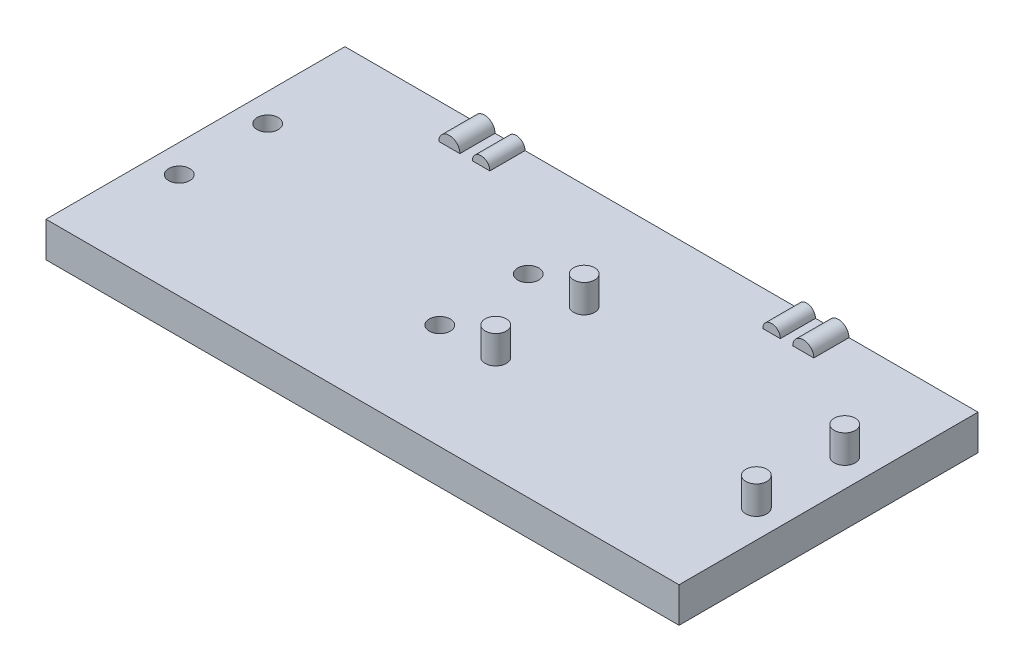
ISO-10303-21;
HEADER;
FILE_DESCRIPTION(('STEP AP214'),'2;1');
FILE_NAME('part.step','',(''),(''),'','','');
FILE_SCHEMA(('AUTOMOTIVE_DESIGN { 1 0 10303 214 1 1 1 1 }'));
ENDSEC;
DATA;
#1=APPLICATION_CONTEXT('core data for automotive mechanical design processes');
#2=APPLICATION_PROTOCOL_DEFINITION('international standard','automotive_design',2000,#1);
#3=PRODUCT_CONTEXT('',#1,'mechanical');
#4=PRODUCT('Part','Part','',(#3));
#5=PRODUCT_RELATED_PRODUCT_CATEGORY('part','',(#4));
#6=PRODUCT_DEFINITION_FORMATION('','',#4);
#7=PRODUCT_DEFINITION_CONTEXT('part definition',#1,'design');
#8=PRODUCT_DEFINITION('design','',#6,#7);
#9=PRODUCT_DEFINITION_SHAPE('','',#8);
#10=(LENGTH_UNIT() NAMED_UNIT(*) SI_UNIT(.MILLI.,.METRE.));
#11=(NAMED_UNIT(*) PLANE_ANGLE_UNIT() SI_UNIT($,.RADIAN.));
#12=(NAMED_UNIT(*) SI_UNIT($,.STERADIAN.) SOLID_ANGLE_UNIT());
#13=UNCERTAINTY_MEASURE_WITH_UNIT(LENGTH_MEASURE(1.E-05),#10,'distance_accuracy_value','');
#14=(GEOMETRIC_REPRESENTATION_CONTEXT(3) GLOBAL_UNCERTAINTY_ASSIGNED_CONTEXT((#13)) GLOBAL_UNIT_ASSIGNED_CONTEXT((#10,
#11,#12)) REPRESENTATION_CONTEXT('',''));
#15=CARTESIAN_POINT('',(0.,0.,0.));
#16=DIRECTION('',(0.,0.,1.));
#17=DIRECTION('',(1.,0.,0.));
#18=AXIS2_PLACEMENT_3D('',#15,#16,#17);
#19=CARTESIAN_POINT('',(-90.,10.,-42.5));
#20=DIRECTION('',(1.,0.,0.));
#21=DIRECTION('',(0.,0.,-1.));
#22=AXIS2_PLACEMENT_3D('',#19,#20,#21);
#23=PLANE('',#22);
#24=DIRECTION('',(0.,0.,1.));
#25=VECTOR('',#24,1.);
#26=CARTESIAN_POINT('',(-90.,0.,-42.5));
#27=LINE('',#26,#25);
#28=CARTESIAN_POINT('',(-90.,0.,-42.5));
#29=VERTEX_POINT('',#28);
#30=CARTESIAN_POINT('',(-89.9999999999999,0.,42.5));
#31=VERTEX_POINT('',#30);
#32=EDGE_CURVE('E231',#29,#31,#27,.T.);
#33=ORIENTED_EDGE('',*,*,#32,.T.);
#34=DIRECTION('',(0.,-1.,0.));
#35=VECTOR('',#34,1.);
#36=CARTESIAN_POINT('',(-89.9999999999999,10.,42.5));
#37=LINE('',#36,#35);
#38=CARTESIAN_POINT('',(-89.9999999999999,10.,42.5));
#39=VERTEX_POINT('',#38);
#40=EDGE_CURVE('E255',#39,#31,#37,.T.);
#41=ORIENTED_EDGE('',*,*,#40,.F.);
#42=DIRECTION('',(0.,0.,1.));
#43=VECTOR('',#42,1.);
#44=CARTESIAN_POINT('',(-90.,10.,-42.5));
#45=LINE('',#44,#43);
#46=CARTESIAN_POINT('',(-90.,10.,-42.5));
#47=VERTEX_POINT('',#46);
#48=EDGE_CURVE('E234',#47,#39,#45,.T.);
#49=ORIENTED_EDGE('',*,*,#48,.F.);
#50=DIRECTION('',(0.,-1.,0.));
#51=VECTOR('',#50,1.);
#52=CARTESIAN_POINT('',(-90.,10.,-42.5));
#53=LINE('',#52,#51);
#54=EDGE_CURVE('E128',#47,#29,#53,.T.);
#55=ORIENTED_EDGE('',*,*,#54,.T.);
#56=EDGE_LOOP('',(#33,#41,#49,#55));
#57=FACE_BOUND('',#56,.T.);
#58=ADVANCED_FACE('F35',(#57),#23,.F.);
#59=CARTESIAN_POINT('',(-89.9999999999999,10.,42.5));
#60=DIRECTION('',(0.,0.,-1.));
#61=DIRECTION('',(-1.,0.,0.));
#62=AXIS2_PLACEMENT_3D('',#59,#60,#61);
#63=PLANE('',#62);
#64=DIRECTION('',(1.,0.,0.));
#65=VECTOR('',#64,1.);
#66=CARTESIAN_POINT('',(-89.9999999999999,0.,42.5));
#67=LINE('',#66,#65);
#68=CARTESIAN_POINT('',(90.0000000000001,0.,42.5));
#69=VERTEX_POINT('',#68);
#70=EDGE_CURVE('E243',#31,#69,#67,.T.);
#71=ORIENTED_EDGE('',*,*,#70,.T.);
#72=DIRECTION('',(0.,-1.,0.));
#73=VECTOR('',#72,1.);
#74=CARTESIAN_POINT('',(90.0000000000001,10.,42.5));
#75=LINE('',#74,#73);
#76=CARTESIAN_POINT('',(90.0000000000001,10.,42.5));
#77=VERTEX_POINT('',#76);
#78=EDGE_CURVE('E252',#77,#69,#75,.T.);
#79=ORIENTED_EDGE('',*,*,#78,.F.);
#80=DIRECTION('',(1.,0.,0.));
#81=VECTOR('',#80,1.);
#82=CARTESIAN_POINT('',(-89.9999999999999,10.,42.5));
#83=LINE('',#82,#81);
#84=EDGE_CURVE('E236',#39,#77,#83,.T.);
#85=ORIENTED_EDGE('',*,*,#84,.F.);
#86=ORIENTED_EDGE('',*,*,#40,.T.);
#87=EDGE_LOOP('',(#71,#79,#85,#86));
#88=FACE_BOUND('',#87,.T.);
#89=ADVANCED_FACE('F283',(#88),#63,.F.);
#90=CARTESIAN_POINT('',(90.,10.,-42.5));
#91=DIRECTION('',(-1.,0.,0.));
#92=DIRECTION('',(0.,0.,1.));
#93=AXIS2_PLACEMENT_3D('',#90,#91,#92);
#94=PLANE('',#93);
#95=DIRECTION('',(0.,0.,-1.));
#96=VECTOR('',#95,1.);
#97=CARTESIAN_POINT('',(90.,0.,-42.5));
#98=LINE('',#97,#96);
#99=CARTESIAN_POINT('',(90.,0.,-42.5));
#100=VERTEX_POINT('',#99);
#101=EDGE_CURVE('E245',#69,#100,#98,.T.);
#102=ORIENTED_EDGE('',*,*,#101,.T.);
#103=DIRECTION('',(0.,-1.,0.));
#104=VECTOR('',#103,1.);
#105=CARTESIAN_POINT('',(90.,10.,-42.5));
#106=LINE('',#105,#104);
#107=CARTESIAN_POINT('',(90.,10.,-42.5));
#108=VERTEX_POINT('',#107);
#109=EDGE_CURVE('E249',#108,#100,#106,.T.);
#110=ORIENTED_EDGE('',*,*,#109,.F.);
#111=DIRECTION('',(0.,0.,-1.));
#112=VECTOR('',#111,1.);
#113=CARTESIAN_POINT('',(90.,10.,-42.5));
#114=LINE('',#113,#112);
#115=EDGE_CURVE('E132',#77,#108,#114,.T.);
#116=ORIENTED_EDGE('',*,*,#115,.F.);
#117=ORIENTED_EDGE('',*,*,#78,.T.);
#118=EDGE_LOOP('',(#102,#110,#116,#117));
#119=FACE_BOUND('',#118,.T.);
#120=ADVANCED_FACE('F288',(#119),#94,.F.);
#121=CARTESIAN_POINT('',(-90.,10.,-42.5));
#122=DIRECTION('',(0.,0.,1.));
#123=DIRECTION('',(1.,0.,0.));
#124=AXIS2_PLACEMENT_3D('',#121,#122,#123);
#125=PLANE('',#124);
#126=DIRECTION('',(-1.,0.,0.));
#127=VECTOR('',#126,1.);
#128=CARTESIAN_POINT('',(-90.,0.,-42.5));
#129=LINE('',#128,#127);
#130=EDGE_CURVE('E237',#100,#29,#129,.T.);
#131=ORIENTED_EDGE('',*,*,#130,.T.);
#132=ORIENTED_EDGE('',*,*,#54,.F.);
#133=DIRECTION('',(-1.,0.,0.));
#134=VECTOR('',#133,1.);
#135=CARTESIAN_POINT('',(-90.,10.,-42.5));
#136=LINE('',#135,#134);
#137=CARTESIAN_POINT('',(-53.3192352652046,10.,-42.5));
#138=VERTEX_POINT('',#137);
#139=EDGE_CURVE('E123',#138,#47,#136,.T.);
#140=ORIENTED_EDGE('',*,*,#139,.F.);
#141=CARTESIAN_POINT('',(-50.3192352652046,10.,-42.5));
#142=DIRECTION('',(0.,0.,-1.));
#143=DIRECTION('',(-1.,0.,0.));
#144=AXIS2_PLACEMENT_3D('',#141,#142,#143);
#145=CIRCLE('',#144,3.);
#146=CARTESIAN_POINT('',(-47.3192352652046,10.,-42.5));
#147=VERTEX_POINT('',#146);
#148=EDGE_CURVE('E126',#138,#147,#145,.T.);
#149=ORIENTED_EDGE('',*,*,#148,.T.);
#150=CARTESIAN_POINT('',(-43.7947027926347,10.,-42.5));
#151=VERTEX_POINT('',#150);
#152=EDGE_CURVE('E131',#151,#147,#136,.T.);
#153=ORIENTED_EDGE('',*,*,#152,.F.);
#154=CARTESIAN_POINT('',(-41.2947027926347,10.,-42.5));
#155=DIRECTION('',(0.,0.,-1.));
#156=DIRECTION('',(-1.,0.,0.));
#157=AXIS2_PLACEMENT_3D('',#154,#155,#156);
#158=CIRCLE('',#157,2.5);
#159=CARTESIAN_POINT('',(-38.7947027926347,10.,-42.5));
#160=VERTEX_POINT('',#159);
#161=EDGE_CURVE('E161',#151,#160,#158,.T.);
#162=ORIENTED_EDGE('',*,*,#161,.T.);
#163=CARTESIAN_POINT('',(38.7947027926347,10.,-42.5));
#164=VERTEX_POINT('',#163);
#165=EDGE_CURVE('E134',#164,#160,#136,.T.);
#166=ORIENTED_EDGE('',*,*,#165,.F.);
#167=CARTESIAN_POINT('',(41.2947027926347,10.,-42.5));
#168=DIRECTION('',(0.,0.,-1.));
#169=DIRECTION('',(1.,0.,0.));
#170=AXIS2_PLACEMENT_3D('',#167,#168,#169);
#171=CIRCLE('',#170,2.5);
#172=CARTESIAN_POINT('',(43.7947027926346,10.,-42.5));
#173=VERTEX_POINT('',#172);
#174=EDGE_CURVE('E141',#164,#173,#171,.T.);
#175=ORIENTED_EDGE('',*,*,#174,.T.);
#176=CARTESIAN_POINT('',(47.3192352652046,10.,-42.5));
#177=VERTEX_POINT('',#176);
#178=EDGE_CURVE('E240',#177,#173,#136,.T.);
#179=ORIENTED_EDGE('',*,*,#178,.F.);
#180=CARTESIAN_POINT('',(50.3192352652046,10.,-42.5));
#181=DIRECTION('',(0.,0.,-1.));
#182=DIRECTION('',(1.,0.,0.));
#183=AXIS2_PLACEMENT_3D('',#180,#181,#182);
#184=CIRCLE('',#183,3.);
#185=CARTESIAN_POINT('',(53.3192352652045,10.,-42.5));
#186=VERTEX_POINT('',#185);
#187=EDGE_CURVE('E175',#177,#186,#184,.T.);
#188=ORIENTED_EDGE('',*,*,#187,.T.);
#189=EDGE_CURVE('E135',#108,#186,#136,.T.);
#190=ORIENTED_EDGE('',*,*,#189,.F.);
#191=ORIENTED_EDGE('',*,*,#109,.T.);
#192=EDGE_LOOP('',(#131,#132,#140,#149,#153,#162,#166,#175,#179,#188,#190,#191));
#193=FACE_BOUND('',#192,.T.);
#194=ADVANCED_FACE('F124',(#193),#125,.F.);
#195=CARTESIAN_POINT('',(0.,10.,0.));
#196=DIRECTION('',(0.,1.,0.));
#197=DIRECTION('',(0.,0.,1.));
#198=AXIS2_PLACEMENT_3D('',#195,#196,#197);
#199=PLANE('',#198);
#200=DIRECTION('',(0.,0.,-1.));
#201=VECTOR('',#200,1.);
#202=CARTESIAN_POINT('',(-47.3192352652046,10.,-32.5));
#203=LINE('',#202,#201);
#204=CARTESIAN_POINT('',(-47.3192352652046,10.,-32.5));
#205=VERTEX_POINT('',#204);
#206=EDGE_CURVE('E54',#205,#147,#203,.T.);
#207=ORIENTED_EDGE('',*,*,#206,.F.);
#208=DIRECTION('',(-1.,0.,0.));
#209=VECTOR('',#208,1.);
#210=CARTESIAN_POINT('',(-53.3192352652046,10.,-32.5));
#211=LINE('',#210,#209);
#212=CARTESIAN_POINT('',(-53.3192352652046,10.,-32.5));
#213=VERTEX_POINT('',#212);
#214=EDGE_CURVE('E49',#205,#213,#211,.T.);
#215=ORIENTED_EDGE('',*,*,#214,.T.);
#216=DIRECTION('',(0.,0.,-1.));
#217=VECTOR('',#216,1.);
#218=CARTESIAN_POINT('',(-53.3192352652046,10.,-32.5));
#219=LINE('',#218,#217);
#220=EDGE_CURVE('E136',#213,#138,#219,.T.);
#221=ORIENTED_EDGE('',*,*,#220,.T.);
#222=ORIENTED_EDGE('',*,*,#139,.T.);
#223=ORIENTED_EDGE('',*,*,#48,.T.);
#224=ORIENTED_EDGE('',*,*,#84,.T.);
#225=ORIENTED_EDGE('',*,*,#115,.T.);
#226=ORIENTED_EDGE('',*,*,#189,.T.);
#227=DIRECTION('',(0.,0.,-1.));
#228=VECTOR('',#227,1.);
#229=CARTESIAN_POINT('',(53.3192352652046,10.,-32.5));
#230=LINE('',#229,#228);
#231=CARTESIAN_POINT('',(53.3192352652046,10.,-32.5));
#232=VERTEX_POINT('',#231);
#233=EDGE_CURVE('E183',#232,#186,#230,.T.);
#234=ORIENTED_EDGE('',*,*,#233,.F.);
#235=DIRECTION('',(-1.,0.,0.));
#236=VECTOR('',#235,1.);
#237=CARTESIAN_POINT('',(53.3192352652046,10.,-32.5));
#238=LINE('',#237,#236);
#239=CARTESIAN_POINT('',(47.3192352652046,10.,-32.5));
#240=VERTEX_POINT('',#239);
#241=EDGE_CURVE('E181',#232,#240,#238,.T.);
#242=ORIENTED_EDGE('',*,*,#241,.T.);
#243=DIRECTION('',(0.,0.,-1.));
#244=VECTOR('',#243,1.);
#245=CARTESIAN_POINT('',(47.3192352652046,10.,-32.5));
#246=LINE('',#245,#244);
#247=EDGE_CURVE('E186',#240,#177,#246,.T.);
#248=ORIENTED_EDGE('',*,*,#247,.T.);
#249=ORIENTED_EDGE('',*,*,#178,.T.);
#250=DIRECTION('',(0.,0.,-1.));
#251=VECTOR('',#250,1.);
#252=CARTESIAN_POINT('',(43.7947027926347,10.,-32.5));
#253=LINE('',#252,#251);
#254=CARTESIAN_POINT('',(43.7947027926347,10.,-32.5));
#255=VERTEX_POINT('',#254);
#256=EDGE_CURVE('E155',#255,#173,#253,.T.);
#257=ORIENTED_EDGE('',*,*,#256,.F.);
#258=DIRECTION('',(-1.,0.,0.));
#259=VECTOR('',#258,1.);
#260=CARTESIAN_POINT('',(43.7947027926347,10.,-32.5));
#261=LINE('',#260,#259);
#262=CARTESIAN_POINT('',(38.7947027926347,10.,-32.5));
#263=VERTEX_POINT('',#262);
#264=EDGE_CURVE('E153',#255,#263,#261,.T.);
#265=ORIENTED_EDGE('',*,*,#264,.T.);
#266=DIRECTION('',(0.,0.,-1.));
#267=VECTOR('',#266,1.);
#268=CARTESIAN_POINT('',(38.7947027926347,10.,-32.5));
#269=LINE('',#268,#267);
#270=EDGE_CURVE('E158',#263,#164,#269,.T.);
#271=ORIENTED_EDGE('',*,*,#270,.T.);
#272=ORIENTED_EDGE('',*,*,#165,.T.);
#273=DIRECTION('',(0.,0.,-1.));
#274=VECTOR('',#273,1.);
#275=CARTESIAN_POINT('',(-38.7947027926347,10.,-32.5));
#276=LINE('',#275,#274);
#277=CARTESIAN_POINT('',(-38.7947027926347,10.,-32.5));
#278=VERTEX_POINT('',#277);
#279=EDGE_CURVE('E169',#278,#160,#276,.T.);
#280=ORIENTED_EDGE('',*,*,#279,.F.);
#281=DIRECTION('',(-1.,0.,0.));
#282=VECTOR('',#281,1.);
#283=CARTESIAN_POINT('',(-43.7947027926347,10.,-32.5));
#284=LINE('',#283,#282);
#285=CARTESIAN_POINT('',(-43.7947027926347,10.,-32.5));
#286=VERTEX_POINT('',#285);
#287=EDGE_CURVE('E167',#278,#286,#284,.T.);
#288=ORIENTED_EDGE('',*,*,#287,.T.);
#289=DIRECTION('',(0.,0.,-1.));
#290=VECTOR('',#289,1.);
#291=CARTESIAN_POINT('',(-43.7947027926347,10.,-32.5));
#292=LINE('',#291,#290);
#293=EDGE_CURVE('E172',#286,#151,#292,.T.);
#294=ORIENTED_EDGE('',*,*,#293,.T.);
#295=ORIENTED_EDGE('',*,*,#152,.T.);
#296=EDGE_LOOP('',(#207,#215,#221,#222,#223,#224,#225,#226,#234,#242,#248,#249,#257,#265,#271,
#272,#280,#288,#294,#295));
#297=FACE_BOUND('',#296,.T.);
#298=CARTESIAN_POINT('',(-7.95465094927429,10.,-12.5714647739015));
#299=DIRECTION('',(0.,-1.,0.));
#300=DIRECTION('',(0.,0.,-1.));
#301=AXIS2_PLACEMENT_3D('',#298,#299,#300);
#302=CIRCLE('',#301,3.00000000000001);
#303=CARTESIAN_POINT('',(-7.95465094927429,10.,-15.5714647739015));
#304=VERTEX_POINT('',#303);
#305=EDGE_CURVE('E192',#304,#304,#302,.T.);
#306=ORIENTED_EDGE('',*,*,#305,.T.);
#307=EDGE_LOOP('',(#306));
#308=FACE_BOUND('',#307,.T.);
#309=CARTESIAN_POINT('',(-7.95465094927429,10.,12.5714647739015));
#310=DIRECTION('',(0.,1.,0.));
#311=DIRECTION('',(0.,0.,1.));
#312=AXIS2_PLACEMENT_3D('',#309,#310,#311);
#313=CIRCLE('',#312,3.00000000000001);
#314=CARTESIAN_POINT('',(-7.95465094927429,10.,15.5714647739015));
#315=VERTEX_POINT('',#314);
#316=EDGE_CURVE('E198',#315,#315,#313,.T.);
#317=ORIENTED_EDGE('',*,*,#316,.F.);
#318=EDGE_LOOP('',(#317));
#319=FACE_BOUND('',#318,.T.);
#320=CARTESIAN_POINT('',(-82.0453490507256,10.,12.5714647739015));
#321=DIRECTION('',(0.,-1.,0.));
#322=DIRECTION('',(0.,0.,-1.));
#323=AXIS2_PLACEMENT_3D('',#320,#321,#322);
#324=CIRCLE('',#323,3.00000000000001);
#325=CARTESIAN_POINT('',(-82.0453490507256,10.,9.57146477390153));
#326=VERTEX_POINT('',#325);
#327=EDGE_CURVE('E204',#326,#326,#324,.T.);
#328=ORIENTED_EDGE('',*,*,#327,.T.);
#329=EDGE_LOOP('',(#328));
#330=FACE_BOUND('',#329,.T.);
#331=CARTESIAN_POINT('',(-82.0453490507256,10.,-12.5714647739015));
#332=DIRECTION('',(0.,1.,0.));
#333=DIRECTION('',(0.,0.,1.));
#334=AXIS2_PLACEMENT_3D('',#331,#332,#333);
#335=CIRCLE('',#334,3.00000000000001);
#336=CARTESIAN_POINT('',(-82.0453490507256,10.,-9.57146477390153));
#337=VERTEX_POINT('',#336);
#338=EDGE_CURVE('E207',#337,#337,#335,.T.);
#339=ORIENTED_EDGE('',*,*,#338,.F.);
#340=EDGE_LOOP('',(#339));
#341=FACE_BOUND('',#340,.T.);
#342=CARTESIAN_POINT('',(82.0453490507256,10.,-12.5714647739015));
#343=DIRECTION('',(0.,1.,0.));
#344=DIRECTION('',(0.,0.,1.));
#345=AXIS2_PLACEMENT_3D('',#342,#343,#344);
#346=CIRCLE('',#345,3.00000000000001);
#347=CARTESIAN_POINT('',(82.0453490507256,10.,-9.57146477390153));
#348=VERTEX_POINT('',#347);
#349=EDGE_CURVE('E11',#348,#348,#346,.T.);
#350=ORIENTED_EDGE('',*,*,#349,.F.);
#351=EDGE_LOOP('',(#350));
#352=FACE_BOUND('',#351,.T.);
#353=CARTESIAN_POINT('',(82.0453490507256,10.,12.5714647739015));
#354=DIRECTION('',(0.,1.,0.));
#355=DIRECTION('',(0.,0.,1.));
#356=AXIS2_PLACEMENT_3D('',#353,#354,#355);
#357=CIRCLE('',#356,3.00000000000001);
#358=CARTESIAN_POINT('',(82.0453490507256,10.,15.5714647739015));
#359=VERTEX_POINT('',#358);
#360=EDGE_CURVE('E219',#359,#359,#357,.T.);
#361=ORIENTED_EDGE('',*,*,#360,.F.);
#362=EDGE_LOOP('',(#361));
#363=FACE_BOUND('',#362,.T.);
#364=CARTESIAN_POINT('',(7.95465094927429,10.,12.5714647739015));
#365=DIRECTION('',(0.,1.,0.));
#366=DIRECTION('',(0.,0.,1.));
#367=AXIS2_PLACEMENT_3D('',#364,#365,#366);
#368=CIRCLE('',#367,3.00000000000001);
#369=CARTESIAN_POINT('',(7.95465094927429,10.,15.5714647739015));
#370=VERTEX_POINT('',#369);
#371=EDGE_CURVE('E42',#370,#370,#368,.T.);
#372=ORIENTED_EDGE('',*,*,#371,.F.);
#373=EDGE_LOOP('',(#372));
#374=FACE_BOUND('',#373,.T.);
#375=CARTESIAN_POINT('',(7.95465094927429,10.,-12.5714647739015));
#376=DIRECTION('',(0.,1.,0.));
#377=DIRECTION('',(0.,0.,1.));
#378=AXIS2_PLACEMENT_3D('',#375,#376,#377);
#379=CIRCLE('',#378,3.00000000000001);
#380=CARTESIAN_POINT('',(7.95465094927429,10.,-9.57146477390153));
#381=VERTEX_POINT('',#380);
#382=EDGE_CURVE('E227',#381,#381,#379,.T.);
#383=ORIENTED_EDGE('',*,*,#382,.F.);
#384=EDGE_LOOP('',(#383));
#385=FACE_BOUND('',#384,.T.);
#386=ADVANCED_FACE('F137',(#297,#308,#319,#330,#341,#352,#363,#374,#385),#199,.T.);
#387=CARTESIAN_POINT('',(0.,0.,0.));
#388=DIRECTION('',(0.,1.,0.));
#389=DIRECTION('',(0.,0.,1.));
#390=AXIS2_PLACEMENT_3D('',#387,#388,#389);
#391=PLANE('',#390);
#392=ORIENTED_EDGE('',*,*,#32,.F.);
#393=ORIENTED_EDGE('',*,*,#130,.F.);
#394=ORIENTED_EDGE('',*,*,#101,.F.);
#395=ORIENTED_EDGE('',*,*,#70,.F.);
#396=EDGE_LOOP('',(#392,#393,#394,#395));
#397=FACE_BOUND('',#396,.T.);
#398=ADVANCED_FACE('F264',(#397),#391,.F.);
#399=CARTESIAN_POINT('',(7.95465094927429,18.,-12.5714647739015));
#400=DIRECTION('',(0.,-1.,0.));
#401=DIRECTION('',(0.,0.,-1.));
#402=AXIS2_PLACEMENT_3D('',#399,#400,#401);
#403=CYLINDRICAL_SURFACE('',#402,3.00000000000001);
#404=CARTESIAN_POINT('',(7.95465094927429,18.,-12.5714647739015));
#405=DIRECTION('',(0.,1.,0.));
#406=DIRECTION('',(0.,0.,1.));
#407=AXIS2_PLACEMENT_3D('',#404,#405,#406);
#408=CIRCLE('',#407,3.00000000000001);
#409=CARTESIAN_POINT('',(7.95465094927429,18.,-9.57146477390153));
#410=VERTEX_POINT('',#409);
#411=EDGE_CURVE('E228',#410,#410,#408,.T.);
#412=ORIENTED_EDGE('',*,*,#411,.F.);
#413=EDGE_LOOP('',(#412));
#414=FACE_BOUND('',#413,.T.);
#415=ORIENTED_EDGE('',*,*,#382,.T.);
#416=EDGE_LOOP('',(#415));
#417=FACE_BOUND('',#416,.T.);
#418=ADVANCED_FACE('F268',(#414,#417),#403,.T.);
#419=CARTESIAN_POINT('',(7.95465094927429,18.,-12.5714647739015));
#420=DIRECTION('',(0.,1.,0.));
#421=DIRECTION('',(0.,0.,1.));
#422=AXIS2_PLACEMENT_3D('',#419,#420,#421);
#423=PLANE('',#422);
#424=ORIENTED_EDGE('',*,*,#411,.T.);
#425=EDGE_LOOP('',(#424));
#426=FACE_BOUND('',#425,.T.);
#427=ADVANCED_FACE('F270',(#426),#423,.T.);
#428=CARTESIAN_POINT('',(7.95465094927429,18.,12.5714647739015));
#429=DIRECTION('',(0.,-1.,0.));
#430=DIRECTION('',(0.,0.,-1.));
#431=AXIS2_PLACEMENT_3D('',#428,#429,#430);
#432=CYLINDRICAL_SURFACE('',#431,3.00000000000001);
#433=CARTESIAN_POINT('',(7.95465094927429,18.,12.5714647739015));
#434=DIRECTION('',(0.,-1.,0.));
#435=DIRECTION('',(0.,0.,-1.));
#436=AXIS2_PLACEMENT_3D('',#433,#434,#435);
#437=CIRCLE('',#436,3.00000000000001);
#438=CARTESIAN_POINT('',(7.95465094927429,18.,9.57146477390153));
#439=VERTEX_POINT('',#438);
#440=EDGE_CURVE('E222',#439,#439,#437,.T.);
#441=ORIENTED_EDGE('',*,*,#440,.T.);
#442=EDGE_LOOP('',(#441));
#443=FACE_BOUND('',#442,.T.);
#444=ORIENTED_EDGE('',*,*,#371,.T.);
#445=EDGE_LOOP('',(#444));
#446=FACE_BOUND('',#445,.T.);
#447=ADVANCED_FACE('F260',(#443,#446),#432,.T.);
#448=CARTESIAN_POINT('',(7.95465094927429,18.,12.5714647739015));
#449=DIRECTION('',(0.,-1.,0.));
#450=DIRECTION('',(0.,0.,-1.));
#451=AXIS2_PLACEMENT_3D('',#448,#449,#450);
#452=PLANE('',#451);
#453=ORIENTED_EDGE('',*,*,#440,.F.);
#454=EDGE_LOOP('',(#453));
#455=FACE_BOUND('',#454,.T.);
#456=ADVANCED_FACE('F364',(#455),#452,.F.);
#457=CARTESIAN_POINT('',(82.0453490507256,18.,12.5714647739015));
#458=DIRECTION('',(0.,-1.,0.));
#459=DIRECTION('',(0.,0.,-1.));
#460=AXIS2_PLACEMENT_3D('',#457,#458,#459);
#461=CYLINDRICAL_SURFACE('',#460,3.00000000000001);
#462=CARTESIAN_POINT('',(82.0453490507256,18.,12.5714647739015));
#463=DIRECTION('',(0.,1.,0.));
#464=DIRECTION('',(0.,0.,1.));
#465=AXIS2_PLACEMENT_3D('',#462,#463,#464);
#466=CIRCLE('',#465,3.00000000000001);
#467=CARTESIAN_POINT('',(82.0453490507256,18.,15.5714647739015));
#468=VERTEX_POINT('',#467);
#469=EDGE_CURVE('E218',#468,#468,#466,.T.);
#470=ORIENTED_EDGE('',*,*,#469,.F.);
#471=EDGE_LOOP('',(#470));
#472=FACE_BOUND('',#471,.T.);
#473=ORIENTED_EDGE('',*,*,#360,.T.);
#474=EDGE_LOOP('',(#473));
#475=FACE_BOUND('',#474,.T.);
#476=ADVANCED_FACE('F361',(#472,#475),#461,.T.);
#477=CARTESIAN_POINT('',(82.0453490507256,18.,12.5714647739015));
#478=DIRECTION('',(0.,1.,0.));
#479=DIRECTION('',(0.,0.,1.));
#480=AXIS2_PLACEMENT_3D('',#477,#478,#479);
#481=PLANE('',#480);
#482=ORIENTED_EDGE('',*,*,#469,.T.);
#483=EDGE_LOOP('',(#482));
#484=FACE_BOUND('',#483,.T.);
#485=ADVANCED_FACE('F356',(#484),#481,.T.);
#486=CARTESIAN_POINT('',(82.0453490507256,18.,-12.5714647739015));
#487=DIRECTION('',(0.,-1.,0.));
#488=DIRECTION('',(0.,0.,-1.));
#489=AXIS2_PLACEMENT_3D('',#486,#487,#488);
#490=CYLINDRICAL_SURFACE('',#489,3.00000000000001);
#491=CARTESIAN_POINT('',(82.0453490507256,18.,-12.5714647739015));
#492=DIRECTION('',(0.,-1.,0.));
#493=DIRECTION('',(0.,0.,-1.));
#494=AXIS2_PLACEMENT_3D('',#491,#492,#493);
#495=CIRCLE('',#494,3.00000000000001);
#496=CARTESIAN_POINT('',(82.0453490507256,18.,-15.5714647739015));
#497=VERTEX_POINT('',#496);
#498=EDGE_CURVE('E213',#497,#497,#495,.T.);
#499=ORIENTED_EDGE('',*,*,#498,.T.);
#500=EDGE_LOOP('',(#499));
#501=FACE_BOUND('',#500,.T.);
#502=ORIENTED_EDGE('',*,*,#349,.T.);
#503=EDGE_LOOP('',(#502));
#504=FACE_BOUND('',#503,.T.);
#505=ADVANCED_FACE('F353',(#501,#504),#490,.T.);
#506=CARTESIAN_POINT('',(82.0453490507256,18.,-12.5714647739015));
#507=DIRECTION('',(0.,-1.,0.));
#508=DIRECTION('',(0.,0.,-1.));
#509=AXIS2_PLACEMENT_3D('',#506,#507,#508);
#510=PLANE('',#509);
#511=ORIENTED_EDGE('',*,*,#498,.F.);
#512=EDGE_LOOP('',(#511));
#513=FACE_BOUND('',#512,.T.);
#514=ADVANCED_FACE('F351',(#513),#510,.F.);
#515=CARTESIAN_POINT('',(-82.0453490507256,2.,-12.5714647739015));
#516=DIRECTION('',(0.,1.,0.));
#517=DIRECTION('',(0.,0.,1.));
#518=AXIS2_PLACEMENT_3D('',#515,#516,#517);
#519=CYLINDRICAL_SURFACE('',#518,3.00000000000001);
#520=CARTESIAN_POINT('',(-82.0453490507256,2.,-12.5714647739015));
#521=DIRECTION('',(0.,1.,0.));
#522=DIRECTION('',(0.,0.,1.));
#523=AXIS2_PLACEMENT_3D('',#520,#521,#522);
#524=CIRCLE('',#523,3.00000000000001);
#525=CARTESIAN_POINT('',(-82.0453490507256,2.,-9.57146477390153));
#526=VERTEX_POINT('',#525);
#527=EDGE_CURVE('E210',#526,#526,#524,.T.);
#528=ORIENTED_EDGE('',*,*,#527,.F.);
#529=EDGE_LOOP('',(#528));
#530=FACE_BOUND('',#529,.T.);
#531=ORIENTED_EDGE('',*,*,#338,.T.);
#532=EDGE_LOOP('',(#531));
#533=FACE_BOUND('',#532,.T.);
#534=ADVANCED_FACE('F347',(#530,#533),#519,.F.);
#535=CARTESIAN_POINT('',(-82.0453490507256,2.,-12.5714647739015));
#536=DIRECTION('',(0.,1.,0.));
#537=DIRECTION('',(0.,0.,1.));
#538=AXIS2_PLACEMENT_3D('',#535,#536,#537);
#539=PLANE('',#538);
#540=ORIENTED_EDGE('',*,*,#527,.T.);
#541=EDGE_LOOP('',(#540));
#542=FACE_BOUND('',#541,.T.);
#543=ADVANCED_FACE('F340',(#542),#539,.T.);
#544=CARTESIAN_POINT('',(-82.0453490507256,2.,12.5714647739015));
#545=DIRECTION('',(0.,1.,0.));
#546=DIRECTION('',(0.,0.,1.));
#547=AXIS2_PLACEMENT_3D('',#544,#545,#546);
#548=CYLINDRICAL_SURFACE('',#547,3.00000000000001);
#549=CARTESIAN_POINT('',(-82.0453490507256,2.,12.5714647739015));
#550=DIRECTION('',(0.,-1.,0.));
#551=DIRECTION('',(0.,0.,-1.));
#552=AXIS2_PLACEMENT_3D('',#549,#550,#551);
#553=CIRCLE('',#552,3.00000000000001);
#554=CARTESIAN_POINT('',(-82.0453490507256,2.,9.57146477390153));
#555=VERTEX_POINT('',#554);
#556=EDGE_CURVE('E201',#555,#555,#553,.T.);
#557=ORIENTED_EDGE('',*,*,#556,.T.);
#558=EDGE_LOOP('',(#557));
#559=FACE_BOUND('',#558,.T.);
#560=ORIENTED_EDGE('',*,*,#327,.F.);
#561=EDGE_LOOP('',(#560));
#562=FACE_BOUND('',#561,.T.);
#563=ADVANCED_FACE('F337',(#559,#562),#548,.F.);
#564=CARTESIAN_POINT('',(-82.0453490507256,2.,12.5714647739015));
#565=DIRECTION('',(0.,-1.,0.));
#566=DIRECTION('',(0.,0.,-1.));
#567=AXIS2_PLACEMENT_3D('',#564,#565,#566);
#568=PLANE('',#567);
#569=ORIENTED_EDGE('',*,*,#556,.F.);
#570=EDGE_LOOP('',(#569));
#571=FACE_BOUND('',#570,.T.);
#572=ADVANCED_FACE('F332',(#571),#568,.F.);
#573=CARTESIAN_POINT('',(-7.95465094927429,2.,12.5714647739015));
#574=DIRECTION('',(0.,1.,0.));
#575=DIRECTION('',(0.,0.,1.));
#576=AXIS2_PLACEMENT_3D('',#573,#574,#575);
#577=CYLINDRICAL_SURFACE('',#576,3.00000000000001);
#578=CARTESIAN_POINT('',(-7.95465094927429,2.,12.5714647739015));
#579=DIRECTION('',(0.,1.,0.));
#580=DIRECTION('',(0.,0.,1.));
#581=AXIS2_PLACEMENT_3D('',#578,#579,#580);
#582=CIRCLE('',#581,3.00000000000001);
#583=CARTESIAN_POINT('',(-7.95465094927429,2.,15.5714647739015));
#584=VERTEX_POINT('',#583);
#585=EDGE_CURVE('E195',#584,#584,#582,.T.);
#586=ORIENTED_EDGE('',*,*,#585,.F.);
#587=EDGE_LOOP('',(#586));
#588=FACE_BOUND('',#587,.T.);
#589=ORIENTED_EDGE('',*,*,#316,.T.);
#590=EDGE_LOOP('',(#589));
#591=FACE_BOUND('',#590,.T.);
#592=ADVANCED_FACE('F329',(#588,#591),#577,.F.);
#593=CARTESIAN_POINT('',(-7.95465094927429,2.,12.5714647739015));
#594=DIRECTION('',(0.,1.,0.));
#595=DIRECTION('',(0.,0.,1.));
#596=AXIS2_PLACEMENT_3D('',#593,#594,#595);
#597=PLANE('',#596);
#598=ORIENTED_EDGE('',*,*,#585,.T.);
#599=EDGE_LOOP('',(#598));
#600=FACE_BOUND('',#599,.T.);
#601=ADVANCED_FACE('F324',(#600),#597,.T.);
#602=CARTESIAN_POINT('',(-7.95465094927429,2.,-12.5714647739015));
#603=DIRECTION('',(0.,1.,0.));
#604=DIRECTION('',(0.,0.,1.));
#605=AXIS2_PLACEMENT_3D('',#602,#603,#604);
#606=CYLINDRICAL_SURFACE('',#605,3.00000000000001);
#607=CARTESIAN_POINT('',(-7.95465094927429,2.,-12.5714647739015));
#608=DIRECTION('',(0.,-1.,0.));
#609=DIRECTION('',(0.,0.,-1.));
#610=AXIS2_PLACEMENT_3D('',#607,#608,#609);
#611=CIRCLE('',#610,3.00000000000001);
#612=CARTESIAN_POINT('',(-7.95465094927429,2.,-15.5714647739015));
#613=VERTEX_POINT('',#612);
#614=EDGE_CURVE('E189',#613,#613,#611,.T.);
#615=ORIENTED_EDGE('',*,*,#614,.T.);
#616=EDGE_LOOP('',(#615));
#617=FACE_BOUND('',#616,.T.);
#618=ORIENTED_EDGE('',*,*,#305,.F.);
#619=EDGE_LOOP('',(#618));
#620=FACE_BOUND('',#619,.T.);
#621=ADVANCED_FACE('F321',(#617,#620),#606,.F.);
#622=CARTESIAN_POINT('',(-7.95465094927429,2.,-12.5714647739015));
#623=DIRECTION('',(0.,-1.,0.));
#624=DIRECTION('',(0.,0.,-1.));
#625=AXIS2_PLACEMENT_3D('',#622,#623,#624);
#626=PLANE('',#625);
#627=ORIENTED_EDGE('',*,*,#614,.F.);
#628=EDGE_LOOP('',(#627));
#629=FACE_BOUND('',#628,.T.);
#630=ADVANCED_FACE('F317',(#629),#626,.F.);
#631=CARTESIAN_POINT('',(50.3192352652046,10.,-32.5));
#632=DIRECTION('',(0.,0.,-1.));
#633=DIRECTION('',(-1.,0.,0.));
#634=AXIS2_PLACEMENT_3D('',#631,#632,#633);
#635=CYLINDRICAL_SURFACE('',#634,3.);
#636=ORIENTED_EDGE('',*,*,#187,.F.);
#637=ORIENTED_EDGE('',*,*,#247,.F.);
#638=CARTESIAN_POINT('',(50.3192352652046,10.,-32.5));
#639=DIRECTION('',(0.,0.,-1.));
#640=DIRECTION('',(1.,0.,0.));
#641=AXIS2_PLACEMENT_3D('',#638,#639,#640);
#642=CIRCLE('',#641,3.);
#643=EDGE_CURVE('E178',#240,#232,#642,.T.);
#644=ORIENTED_EDGE('',*,*,#643,.T.);
#645=ORIENTED_EDGE('',*,*,#233,.T.);
#646=EDGE_LOOP('',(#636,#637,#644,#645));
#647=FACE_BOUND('',#646,.T.);
#648=ADVANCED_FACE('F302',(#647),#635,.T.);
#649=CARTESIAN_POINT('',(50.3192352652046,10.,-32.5));
#650=DIRECTION('',(0.,0.,1.));
#651=DIRECTION('',(1.,0.,0.));
#652=AXIS2_PLACEMENT_3D('',#649,#650,#651);
#653=PLANE('',#652);
#654=ORIENTED_EDGE('',*,*,#643,.F.);
#655=ORIENTED_EDGE('',*,*,#241,.F.);
#656=EDGE_LOOP('',(#654,#655));
#657=FACE_BOUND('',#656,.T.);
#658=ADVANCED_FACE('F306',(#657),#653,.T.);
#659=CARTESIAN_POINT('',(-41.2947027926347,10.,-32.5));
#660=DIRECTION('',(0.,0.,-1.));
#661=DIRECTION('',(-1.,0.,0.));
#662=AXIS2_PLACEMENT_3D('',#659,#660,#661);
#663=CYLINDRICAL_SURFACE('',#662,2.5);
#664=ORIENTED_EDGE('',*,*,#161,.F.);
#665=ORIENTED_EDGE('',*,*,#293,.F.);
#666=CARTESIAN_POINT('',(-41.2947027926347,10.,-32.5));
#667=DIRECTION('',(0.,0.,-1.));
#668=DIRECTION('',(-1.,0.,0.));
#669=AXIS2_PLACEMENT_3D('',#666,#667,#668);
#670=CIRCLE('',#669,2.5);
#671=EDGE_CURVE('E164',#286,#278,#670,.T.);
#672=ORIENTED_EDGE('',*,*,#671,.T.);
#673=ORIENTED_EDGE('',*,*,#279,.T.);
#674=EDGE_LOOP('',(#664,#665,#672,#673));
#675=FACE_BOUND('',#674,.T.);
#676=ADVANCED_FACE('F308',(#675),#663,.T.);
#677=CARTESIAN_POINT('',(-41.2947027926347,10.,-32.5));
#678=DIRECTION('',(0.,0.,-1.));
#679=DIRECTION('',(-1.,0.,0.));
#680=AXIS2_PLACEMENT_3D('',#677,#678,#679);
#681=PLANE('',#680);
#682=ORIENTED_EDGE('',*,*,#671,.F.);
#683=ORIENTED_EDGE('',*,*,#287,.F.);
#684=EDGE_LOOP('',(#682,#683));
#685=FACE_BOUND('',#684,.T.);
#686=ADVANCED_FACE('F314',(#685),#681,.F.);
#687=CARTESIAN_POINT('',(41.2947027926347,10.,-32.5));
#688=DIRECTION('',(0.,0.,-1.));
#689=DIRECTION('',(-1.,0.,0.));
#690=AXIS2_PLACEMENT_3D('',#687,#688,#689);
#691=CYLINDRICAL_SURFACE('',#690,2.5);
#692=ORIENTED_EDGE('',*,*,#174,.F.);
#693=ORIENTED_EDGE('',*,*,#270,.F.);
#694=CARTESIAN_POINT('',(41.2947027926347,10.,-32.5));
#695=DIRECTION('',(0.,0.,-1.));
#696=DIRECTION('',(1.,0.,0.));
#697=AXIS2_PLACEMENT_3D('',#694,#695,#696);
#698=CIRCLE('',#697,2.5);
#699=EDGE_CURVE('E150',#263,#255,#698,.T.);
#700=ORIENTED_EDGE('',*,*,#699,.T.);
#701=ORIENTED_EDGE('',*,*,#256,.T.);
#702=EDGE_LOOP('',(#692,#693,#700,#701));
#703=FACE_BOUND('',#702,.T.);
#704=ADVANCED_FACE('F458',(#703),#691,.T.);
#705=CARTESIAN_POINT('',(41.2947027926347,10.,-32.5));
#706=DIRECTION('',(0.,0.,1.));
#707=DIRECTION('',(1.,0.,0.));
#708=AXIS2_PLACEMENT_3D('',#705,#706,#707);
#709=PLANE('',#708);
#710=ORIENTED_EDGE('',*,*,#699,.F.);
#711=ORIENTED_EDGE('',*,*,#264,.F.);
#712=EDGE_LOOP('',(#710,#711));
#713=FACE_BOUND('',#712,.T.);
#714=ADVANCED_FACE('F467',(#713),#709,.T.);
#715=CARTESIAN_POINT('',(-50.3192352652046,10.,-32.5));
#716=DIRECTION('',(0.,0.,-1.));
#717=DIRECTION('',(-1.,0.,0.));
#718=AXIS2_PLACEMENT_3D('',#715,#716,#717);
#719=CYLINDRICAL_SURFACE('',#718,3.);
#720=ORIENTED_EDGE('',*,*,#148,.F.);
#721=ORIENTED_EDGE('',*,*,#220,.F.);
#722=CARTESIAN_POINT('',(-50.3192352652046,10.,-32.5));
#723=DIRECTION('',(0.,0.,-1.));
#724=DIRECTION('',(-1.,0.,0.));
#725=AXIS2_PLACEMENT_3D('',#722,#723,#724);
#726=CIRCLE('',#725,3.);
#727=EDGE_CURVE('E144',#213,#205,#726,.T.);
#728=ORIENTED_EDGE('',*,*,#727,.T.);
#729=ORIENTED_EDGE('',*,*,#206,.T.);
#730=EDGE_LOOP('',(#720,#721,#728,#729));
#731=FACE_BOUND('',#730,.T.);
#732=ADVANCED_FACE('F143',(#731),#719,.T.);
#733=CARTESIAN_POINT('',(-50.3192352652046,10.,-32.5));
#734=DIRECTION('',(0.,0.,-1.));
#735=DIRECTION('',(-1.,0.,0.));
#736=AXIS2_PLACEMENT_3D('',#733,#734,#735);
#737=PLANE('',#736);
#738=ORIENTED_EDGE('',*,*,#727,.F.);
#739=ORIENTED_EDGE('',*,*,#214,.F.);
#740=EDGE_LOOP('',(#738,#739));
#741=FACE_BOUND('',#740,.T.);
#742=ADVANCED_FACE('F486',(#741),#737,.F.);
#743=CLOSED_SHELL('',(#58,#89,#120,#194,#386,#398,#418,#427,#447,#456,#476,#485,#505,#514,#534,
#543,#563,#572,#592,#601,#621,#630,#648,#658,#676,#686,#704,#714,#732,#742));
#744=MANIFOLD_SOLID_BREP('B2',#743);
#745=ADVANCED_BREP_SHAPE_REPRESENTATION('',(#18,#744),#14);
#746=SHAPE_DEFINITION_REPRESENTATION(#9,#745);
ENDSEC;
END-ISO-10303-21;
